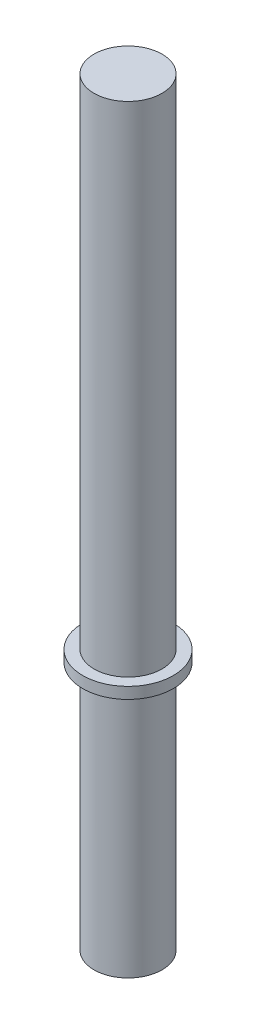
ISO-10303-21;
HEADER;
FILE_DESCRIPTION(('STEP AP214'),'2;1');
FILE_NAME('part.step','',(''),(''),'','','');
FILE_SCHEMA(('AUTOMOTIVE_DESIGN { 1 0 10303 214 1 1 1 1 }'));
ENDSEC;
DATA;
#1=APPLICATION_CONTEXT('core data for automotive mechanical design processes');
#2=APPLICATION_PROTOCOL_DEFINITION('international standard','automotive_design',2000,#1);
#3=PRODUCT_CONTEXT('',#1,'mechanical');
#4=PRODUCT('Part','Part','',(#3));
#5=PRODUCT_RELATED_PRODUCT_CATEGORY('part','',(#4));
#6=PRODUCT_DEFINITION_FORMATION('','',#4);
#7=PRODUCT_DEFINITION_CONTEXT('part definition',#1,'design');
#8=PRODUCT_DEFINITION('design','',#6,#7);
#9=PRODUCT_DEFINITION_SHAPE('','',#8);
#10=(LENGTH_UNIT() NAMED_UNIT(*) SI_UNIT(.MILLI.,.METRE.));
#11=(NAMED_UNIT(*) PLANE_ANGLE_UNIT() SI_UNIT($,.RADIAN.));
#12=(NAMED_UNIT(*) SI_UNIT($,.STERADIAN.) SOLID_ANGLE_UNIT());
#13=UNCERTAINTY_MEASURE_WITH_UNIT(LENGTH_MEASURE(1.E-05),#10,'distance_accuracy_value','');
#14=(GEOMETRIC_REPRESENTATION_CONTEXT(3) GLOBAL_UNCERTAINTY_ASSIGNED_CONTEXT((#13)) GLOBAL_UNIT_ASSIGNED_CONTEXT((#10,
#11,#12)) REPRESENTATION_CONTEXT('',''));
#15=CARTESIAN_POINT('',(0.,0.,0.));
#16=DIRECTION('',(0.,0.,1.));
#17=DIRECTION('',(1.,0.,0.));
#18=AXIS2_PLACEMENT_3D('',#15,#16,#17);
#19=CARTESIAN_POINT('',(0.,33.5,0.));
#20=DIRECTION('',(0.,-1.,0.));
#21=DIRECTION('',(0.,0.,-1.));
#22=AXIS2_PLACEMENT_3D('',#19,#20,#21);
#23=CYLINDRICAL_SURFACE('',#22,1.5);
#24=CARTESIAN_POINT('',(0.,33.5,0.));
#25=DIRECTION('',(0.,1.,0.));
#26=DIRECTION('',(0.,0.,1.));
#27=AXIS2_PLACEMENT_3D('',#24,#25,#26);
#28=CIRCLE('',#27,1.5);
#29=CARTESIAN_POINT('',(0.,33.5,1.5));
#30=VERTEX_POINT('',#29);
#31=EDGE_CURVE('E40',#30,#30,#28,.T.);
#32=ORIENTED_EDGE('',*,*,#31,.F.);
#33=EDGE_LOOP('',(#32));
#34=FACE_BOUND('',#33,.T.);
#35=CARTESIAN_POINT('',(0.,11.5,0.));
#36=DIRECTION('',(0.,-1.,0.));
#37=DIRECTION('',(0.,0.,-1.));
#38=AXIS2_PLACEMENT_3D('',#35,#36,#37);
#39=CIRCLE('',#38,1.5);
#40=CARTESIAN_POINT('',(0.,11.5,-1.5));
#41=VERTEX_POINT('',#40);
#42=EDGE_CURVE('E10',#41,#41,#39,.T.);
#43=ORIENTED_EDGE('',*,*,#42,.F.);
#44=EDGE_LOOP('',(#43));
#45=FACE_BOUND('',#44,.T.);
#46=ADVANCED_FACE('F33',(#34,#45),#23,.T.);
#47=CARTESIAN_POINT('',(0.,33.5,0.));
#48=DIRECTION('',(0.,1.,0.));
#49=DIRECTION('',(0.,0.,1.));
#50=AXIS2_PLACEMENT_3D('',#47,#48,#49);
#51=PLANE('',#50);
#52=ORIENTED_EDGE('',*,*,#31,.T.);
#53=EDGE_LOOP('',(#52));
#54=FACE_BOUND('',#53,.T.);
#55=ADVANCED_FACE('F72',(#54),#51,.T.);
#56=CARTESIAN_POINT('',(0.,11.5,0.));
#57=DIRECTION('',(0.,-1.,0.));
#58=DIRECTION('',(0.,0.,-1.));
#59=AXIS2_PLACEMENT_3D('',#56,#57,#58);
#60=CYLINDRICAL_SURFACE('',#59,2.);
#61=CARTESIAN_POINT('',(0.,11.5,0.));
#62=DIRECTION('',(0.,-1.,0.));
#63=DIRECTION('',(0.,0.,-1.));
#64=AXIS2_PLACEMENT_3D('',#61,#62,#63);
#65=CIRCLE('',#64,2.);
#66=CARTESIAN_POINT('',(0.,11.5,-2.));
#67=VERTEX_POINT('',#66);
#68=EDGE_CURVE('E49',#67,#67,#65,.T.);
#69=ORIENTED_EDGE('',*,*,#68,.T.);
#70=EDGE_LOOP('',(#69));
#71=FACE_BOUND('',#70,.T.);
#72=CARTESIAN_POINT('',(0.,11.,0.));
#73=DIRECTION('',(0.,-1.,0.));
#74=DIRECTION('',(0.,0.,-1.));
#75=AXIS2_PLACEMENT_3D('',#72,#73,#74);
#76=CIRCLE('',#75,2.);
#77=CARTESIAN_POINT('',(0.,11.,-2.));
#78=VERTEX_POINT('',#77);
#79=EDGE_CURVE('E51',#78,#78,#76,.T.);
#80=ORIENTED_EDGE('',*,*,#79,.F.);
#81=EDGE_LOOP('',(#80));
#82=FACE_BOUND('',#81,.T.);
#83=ADVANCED_FACE('F70',(#71,#82),#60,.T.);
#84=CARTESIAN_POINT('',(0.,11.5,0.));
#85=DIRECTION('',(0.,-1.,0.));
#86=DIRECTION('',(0.,0.,-1.));
#87=AXIS2_PLACEMENT_3D('',#84,#85,#86);
#88=PLANE('',#87);
#89=ORIENTED_EDGE('',*,*,#42,.T.);
#90=EDGE_LOOP('',(#89));
#91=FACE_BOUND('',#90,.T.);
#92=ORIENTED_EDGE('',*,*,#68,.F.);
#93=EDGE_LOOP('',(#92));
#94=FACE_BOUND('',#93,.T.);
#95=ADVANCED_FACE('F66',(#91,#94),#88,.F.);
#96=CARTESIAN_POINT('',(0.,11.,0.));
#97=DIRECTION('',(0.,-1.,0.));
#98=DIRECTION('',(0.,0.,-1.));
#99=AXIS2_PLACEMENT_3D('',#96,#97,#98);
#100=PLANE('',#99);
#101=CARTESIAN_POINT('',(0.,11.,0.));
#102=DIRECTION('',(0.,-1.,0.));
#103=DIRECTION('',(0.,0.,-1.));
#104=AXIS2_PLACEMENT_3D('',#101,#102,#103);
#105=CIRCLE('',#104,1.5);
#106=CARTESIAN_POINT('',(0.,11.,-1.5));
#107=VERTEX_POINT('',#106);
#108=EDGE_CURVE('E54',#107,#107,#105,.T.);
#109=ORIENTED_EDGE('',*,*,#108,.F.);
#110=EDGE_LOOP('',(#109));
#111=FACE_BOUND('',#110,.T.);
#112=ORIENTED_EDGE('',*,*,#79,.T.);
#113=EDGE_LOOP('',(#112));
#114=FACE_BOUND('',#113,.T.);
#115=ADVANCED_FACE('F62',(#111,#114),#100,.T.);
#116=CARTESIAN_POINT('',(0.,0.,0.));
#117=DIRECTION('',(0.,1.,0.));
#118=DIRECTION('',(0.,0.,1.));
#119=AXIS2_PLACEMENT_3D('',#116,#117,#118);
#120=PLANE('',#119);
#121=CARTESIAN_POINT('',(0.,0.,0.));
#122=DIRECTION('',(0.,1.,0.));
#123=DIRECTION('',(0.,0.,1.));
#124=AXIS2_PLACEMENT_3D('',#121,#122,#123);
#125=CIRCLE('',#124,1.5);
#126=CARTESIAN_POINT('',(0.,0.,1.5));
#127=VERTEX_POINT('',#126);
#128=EDGE_CURVE('E44',#127,#127,#125,.T.);
#129=ORIENTED_EDGE('',*,*,#128,.F.);
#130=EDGE_LOOP('',(#129));
#131=FACE_BOUND('',#130,.T.);
#132=ADVANCED_FACE('F65',(#131),#120,.F.);
#133=ORIENTED_EDGE('',*,*,#108,.T.);
#134=EDGE_LOOP('',(#133));
#135=FACE_BOUND('',#134,.T.);
#136=ORIENTED_EDGE('',*,*,#128,.T.);
#137=EDGE_LOOP('',(#136));
#138=FACE_BOUND('',#137,.T.);
#139=ADVANCED_FACE('F35',(#135,#138),#23,.T.);
#140=CLOSED_SHELL('',(#46,#55,#83,#95,#115,#132,#139));
#141=MANIFOLD_SOLID_BREP('B2',#140);
#142=ADVANCED_BREP_SHAPE_REPRESENTATION('',(#18,#141),#14);
#143=SHAPE_DEFINITION_REPRESENTATION(#9,#142);
ENDSEC;
END-ISO-10303-21;
